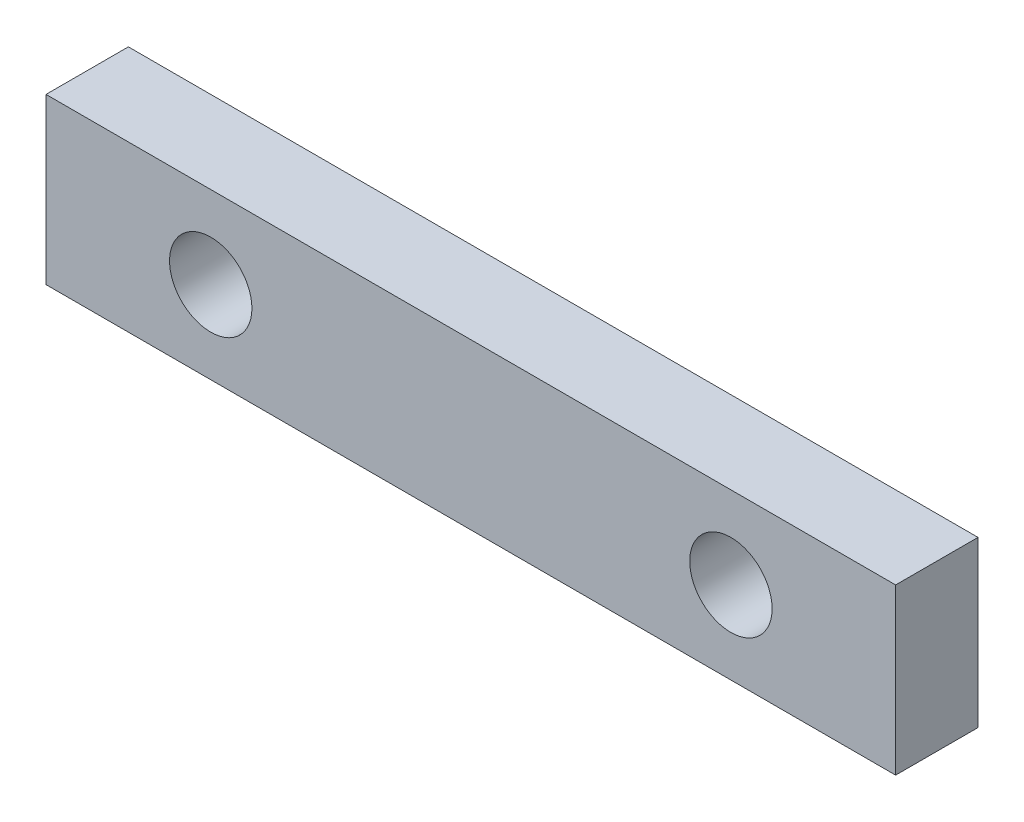
ISO-10303-21;
HEADER;
FILE_DESCRIPTION(('STEP AP214'),'2;1');
FILE_NAME('part.step','',(''),(''),'','','');
FILE_SCHEMA(('AUTOMOTIVE_DESIGN { 1 0 10303 214 1 1 1 1 }'));
ENDSEC;
DATA;
#1=APPLICATION_CONTEXT('core data for automotive mechanical design processes');
#2=APPLICATION_PROTOCOL_DEFINITION('international standard','automotive_design',2000,#1);
#3=PRODUCT_CONTEXT('',#1,'mechanical');
#4=PRODUCT('Part','Part','',(#3));
#5=PRODUCT_RELATED_PRODUCT_CATEGORY('part','',(#4));
#6=PRODUCT_DEFINITION_FORMATION('','',#4);
#7=PRODUCT_DEFINITION_CONTEXT('part definition',#1,'design');
#8=PRODUCT_DEFINITION('design','',#6,#7);
#9=PRODUCT_DEFINITION_SHAPE('','',#8);
#10=(LENGTH_UNIT() NAMED_UNIT(*) SI_UNIT(.MILLI.,.METRE.));
#11=(NAMED_UNIT(*) PLANE_ANGLE_UNIT() SI_UNIT($,.RADIAN.));
#12=(NAMED_UNIT(*) SI_UNIT($,.STERADIAN.) SOLID_ANGLE_UNIT());
#13=UNCERTAINTY_MEASURE_WITH_UNIT(LENGTH_MEASURE(1.E-05),#10,'distance_accuracy_value','');
#14=(GEOMETRIC_REPRESENTATION_CONTEXT(3) GLOBAL_UNCERTAINTY_ASSIGNED_CONTEXT((#13)) GLOBAL_UNIT_ASSIGNED_CONTEXT((#10,
#11,#12)) REPRESENTATION_CONTEXT('',''));
#15=CARTESIAN_POINT('',(0.,0.,0.));
#16=DIRECTION('',(0.,0.,1.));
#17=DIRECTION('',(1.,0.,0.));
#18=AXIS2_PLACEMENT_3D('',#15,#16,#17);
#19=CARTESIAN_POINT('',(0.,6.35,3.175));
#20=DIRECTION('',(0.,0.,-1.));
#21=DIRECTION('',(-1.,0.,0.));
#22=AXIS2_PLACEMENT_3D('',#19,#20,#21);
#23=PLANE('',#22);
#24=CARTESIAN_POINT('',(6.35,3.175,3.175));
#25=DIRECTION('',(0.,0.,1.));
#26=DIRECTION('',(1.,0.,0.));
#27=AXIS2_PLACEMENT_3D('',#24,#25,#26);
#28=CIRCLE('',#27,1.5875);
#29=CARTESIAN_POINT('',(7.9375,3.175,3.175));
#30=VERTEX_POINT('',#29);
#31=EDGE_CURVE('E101',#30,#30,#28,.T.);
#32=ORIENTED_EDGE('',*,*,#31,.F.);
#33=EDGE_LOOP('',(#32));
#34=FACE_BOUND('',#33,.T.);
#35=DIRECTION('',(0.,-1.,0.));
#36=VECTOR('',#35,1.);
#37=CARTESIAN_POINT('',(0.,0.,3.175));
#38=LINE('',#37,#36);
#39=CARTESIAN_POINT('',(0.,6.35,3.175));
#40=VERTEX_POINT('',#39);
#41=CARTESIAN_POINT('',(0.,0.,3.175));
#42=VERTEX_POINT('',#41);
#43=EDGE_CURVE('E86',#40,#42,#38,.T.);
#44=ORIENTED_EDGE('',*,*,#43,.T.);
#45=DIRECTION('',(1.,0.,0.));
#46=VECTOR('',#45,1.);
#47=CARTESIAN_POINT('',(0.,0.,3.175));
#48=LINE('',#47,#46);
#49=CARTESIAN_POINT('',(32.75,0.,3.175));
#50=VERTEX_POINT('',#49);
#51=EDGE_CURVE('E81',#42,#50,#48,.T.);
#52=ORIENTED_EDGE('',*,*,#51,.T.);
#53=DIRECTION('',(0.,1.,0.));
#54=VECTOR('',#53,1.);
#55=CARTESIAN_POINT('',(32.75,0.,3.175));
#56=LINE('',#55,#54);
#57=CARTESIAN_POINT('',(32.75,6.35,3.175));
#58=VERTEX_POINT('',#57);
#59=EDGE_CURVE('E84',#50,#58,#56,.T.);
#60=ORIENTED_EDGE('',*,*,#59,.T.);
#61=DIRECTION('',(-1.,0.,0.));
#62=VECTOR('',#61,1.);
#63=CARTESIAN_POINT('',(0.,6.35,3.175));
#64=LINE('',#63,#62);
#65=EDGE_CURVE('E51',#58,#40,#64,.T.);
#66=ORIENTED_EDGE('',*,*,#65,.T.);
#67=EDGE_LOOP('',(#44,#52,#60,#66));
#68=FACE_BOUND('',#67,.T.);
#69=CARTESIAN_POINT('',(26.4,3.175,3.175));
#70=DIRECTION('',(0.,0.,1.));
#71=DIRECTION('',(1.,0.,0.));
#72=AXIS2_PLACEMENT_3D('',#69,#70,#71);
#73=CIRCLE('',#72,1.5875);
#74=CARTESIAN_POINT('',(27.9875,3.175,3.175));
#75=VERTEX_POINT('',#74);
#76=EDGE_CURVE('E116',#75,#75,#73,.T.);
#77=ORIENTED_EDGE('',*,*,#76,.F.);
#78=EDGE_LOOP('',(#77));
#79=FACE_BOUND('',#78,.T.);
#80=ADVANCED_FACE('F34',(#34,#68,#79),#23,.F.);
#81=CARTESIAN_POINT('',(0.,6.35,0.));
#82=DIRECTION('',(0.,0.,-1.));
#83=DIRECTION('',(-1.,0.,0.));
#84=AXIS2_PLACEMENT_3D('',#81,#82,#83);
#85=PLANE('',#84);
#86=CARTESIAN_POINT('',(6.35,3.175,0.));
#87=DIRECTION('',(0.,0.,1.));
#88=DIRECTION('',(1.,0.,0.));
#89=AXIS2_PLACEMENT_3D('',#86,#87,#88);
#90=CIRCLE('',#89,1.5875);
#91=CARTESIAN_POINT('',(7.9375,3.175,0.));
#92=VERTEX_POINT('',#91);
#93=EDGE_CURVE('E113',#92,#92,#90,.T.);
#94=ORIENTED_EDGE('',*,*,#93,.T.);
#95=EDGE_LOOP('',(#94));
#96=FACE_BOUND('',#95,.T.);
#97=DIRECTION('',(0.,-1.,0.));
#98=VECTOR('',#97,1.);
#99=CARTESIAN_POINT('',(0.,0.,0.));
#100=LINE('',#99,#98);
#101=CARTESIAN_POINT('',(0.,6.35,0.));
#102=VERTEX_POINT('',#101);
#103=CARTESIAN_POINT('',(0.,0.,0.));
#104=VERTEX_POINT('',#103);
#105=EDGE_CURVE('E98',#102,#104,#100,.T.);
#106=ORIENTED_EDGE('',*,*,#105,.F.);
#107=DIRECTION('',(-1.,0.,0.));
#108=VECTOR('',#107,1.);
#109=CARTESIAN_POINT('',(0.,6.35,0.));
#110=LINE('',#109,#108);
#111=CARTESIAN_POINT('',(32.75,6.35,0.));
#112=VERTEX_POINT('',#111);
#113=EDGE_CURVE('E74',#112,#102,#110,.T.);
#114=ORIENTED_EDGE('',*,*,#113,.F.);
#115=DIRECTION('',(0.,1.,0.));
#116=VECTOR('',#115,1.);
#117=CARTESIAN_POINT('',(32.75,0.,0.));
#118=LINE('',#117,#116);
#119=CARTESIAN_POINT('',(32.75,0.,0.));
#120=VERTEX_POINT('',#119);
#121=EDGE_CURVE('E68',#120,#112,#118,.T.);
#122=ORIENTED_EDGE('',*,*,#121,.F.);
#123=DIRECTION('',(1.,0.,0.));
#124=VECTOR('',#123,1.);
#125=CARTESIAN_POINT('',(0.,0.,0.));
#126=LINE('',#125,#124);
#127=EDGE_CURVE('E90',#104,#120,#126,.T.);
#128=ORIENTED_EDGE('',*,*,#127,.F.);
#129=EDGE_LOOP('',(#106,#114,#122,#128));
#130=FACE_BOUND('',#129,.T.);
#131=CARTESIAN_POINT('',(26.4,3.175,0.));
#132=DIRECTION('',(0.,0.,1.));
#133=DIRECTION('',(1.,0.,0.));
#134=AXIS2_PLACEMENT_3D('',#131,#132,#133);
#135=CIRCLE('',#134,1.5875);
#136=CARTESIAN_POINT('',(27.9875,3.175,0.));
#137=VERTEX_POINT('',#136);
#138=EDGE_CURVE('E119',#137,#137,#135,.T.);
#139=ORIENTED_EDGE('',*,*,#138,.T.);
#140=EDGE_LOOP('',(#139));
#141=FACE_BOUND('',#140,.T.);
#142=ADVANCED_FACE('F109',(#96,#130,#141),#85,.T.);
#143=CARTESIAN_POINT('',(0.,0.,3.175));
#144=DIRECTION('',(1.,0.,0.));
#145=DIRECTION('',(0.,0.,-1.));
#146=AXIS2_PLACEMENT_3D('',#143,#144,#145);
#147=PLANE('',#146);
#148=ORIENTED_EDGE('',*,*,#105,.T.);
#149=DIRECTION('',(0.,0.,-1.));
#150=VECTOR('',#149,1.);
#151=CARTESIAN_POINT('',(0.,0.,3.175));
#152=LINE('',#151,#150);
#153=EDGE_CURVE('E11',#42,#104,#152,.T.);
#154=ORIENTED_EDGE('',*,*,#153,.F.);
#155=ORIENTED_EDGE('',*,*,#43,.F.);
#156=DIRECTION('',(0.,0.,-1.));
#157=VECTOR('',#156,1.);
#158=CARTESIAN_POINT('',(0.,6.35,3.175));
#159=LINE('',#158,#157);
#160=EDGE_CURVE('E94',#40,#102,#159,.T.);
#161=ORIENTED_EDGE('',*,*,#160,.T.);
#162=EDGE_LOOP('',(#148,#154,#155,#161));
#163=FACE_BOUND('',#162,.T.);
#164=ADVANCED_FACE('F36',(#163),#147,.F.);
#165=CARTESIAN_POINT('',(0.,0.,3.175));
#166=DIRECTION('',(0.,1.,0.));
#167=DIRECTION('',(0.,0.,1.));
#168=AXIS2_PLACEMENT_3D('',#165,#166,#167);
#169=PLANE('',#168);
#170=ORIENTED_EDGE('',*,*,#127,.T.);
#171=DIRECTION('',(0.,0.,-1.));
#172=VECTOR('',#171,1.);
#173=CARTESIAN_POINT('',(32.75,0.,3.175));
#174=LINE('',#173,#172);
#175=EDGE_CURVE('E43',#50,#120,#174,.T.);
#176=ORIENTED_EDGE('',*,*,#175,.F.);
#177=ORIENTED_EDGE('',*,*,#51,.F.);
#178=ORIENTED_EDGE('',*,*,#153,.T.);
#179=EDGE_LOOP('',(#170,#176,#177,#178));
#180=FACE_BOUND('',#179,.T.);
#181=ADVANCED_FACE('F89',(#180),#169,.F.);
#182=CARTESIAN_POINT('',(32.75,0.,3.175));
#183=DIRECTION('',(-1.,0.,0.));
#184=DIRECTION('',(0.,0.,1.));
#185=AXIS2_PLACEMENT_3D('',#182,#183,#184);
#186=PLANE('',#185);
#187=ORIENTED_EDGE('',*,*,#121,.T.);
#188=DIRECTION('',(0.,0.,-1.));
#189=VECTOR('',#188,1.);
#190=CARTESIAN_POINT('',(32.75,6.35,3.175));
#191=LINE('',#190,#189);
#192=EDGE_CURVE('E91',#58,#112,#191,.T.);
#193=ORIENTED_EDGE('',*,*,#192,.F.);
#194=ORIENTED_EDGE('',*,*,#59,.F.);
#195=ORIENTED_EDGE('',*,*,#175,.T.);
#196=EDGE_LOOP('',(#187,#193,#194,#195));
#197=FACE_BOUND('',#196,.T.);
#198=ADVANCED_FACE('F92',(#197),#186,.F.);
#199=CARTESIAN_POINT('',(0.,6.35,3.175));
#200=DIRECTION('',(0.,-1.,0.));
#201=DIRECTION('',(0.,0.,-1.));
#202=AXIS2_PLACEMENT_3D('',#199,#200,#201);
#203=PLANE('',#202);
#204=ORIENTED_EDGE('',*,*,#113,.T.);
#205=ORIENTED_EDGE('',*,*,#160,.F.);
#206=ORIENTED_EDGE('',*,*,#65,.F.);
#207=ORIENTED_EDGE('',*,*,#192,.T.);
#208=EDGE_LOOP('',(#204,#205,#206,#207));
#209=FACE_BOUND('',#208,.T.);
#210=ADVANCED_FACE('F106',(#209),#203,.F.);
#211=CARTESIAN_POINT('',(6.35,3.175,3.175));
#212=DIRECTION('',(0.,0.,-1.));
#213=DIRECTION('',(-1.,0.,0.));
#214=AXIS2_PLACEMENT_3D('',#211,#212,#213);
#215=CYLINDRICAL_SURFACE('',#214,1.5875);
#216=ORIENTED_EDGE('',*,*,#31,.T.);
#217=EDGE_LOOP('',(#216));
#218=FACE_BOUND('',#217,.T.);
#219=ORIENTED_EDGE('',*,*,#93,.F.);
#220=EDGE_LOOP('',(#219));
#221=FACE_BOUND('',#220,.T.);
#222=ADVANCED_FACE('F137',(#218,#221),#215,.F.);
#223=CARTESIAN_POINT('',(26.4,3.175,3.175));
#224=DIRECTION('',(0.,0.,-1.));
#225=DIRECTION('',(-1.,0.,0.));
#226=AXIS2_PLACEMENT_3D('',#223,#224,#225);
#227=CYLINDRICAL_SURFACE('',#226,1.5875);
#228=ORIENTED_EDGE('',*,*,#76,.T.);
#229=EDGE_LOOP('',(#228));
#230=FACE_BOUND('',#229,.T.);
#231=ORIENTED_EDGE('',*,*,#138,.F.);
#232=EDGE_LOOP('',(#231));
#233=FACE_BOUND('',#232,.T.);
#234=ADVANCED_FACE('F125',(#230,#233),#227,.F.);
#235=CLOSED_SHELL('',(#80,#142,#164,#181,#198,#210,#222,#234));
#236=MANIFOLD_SOLID_BREP('B2',#235);
#237=ADVANCED_BREP_SHAPE_REPRESENTATION('',(#18,#236),#14);
#238=SHAPE_DEFINITION_REPRESENTATION(#9,#237);
ENDSEC;
END-ISO-10303-21;
